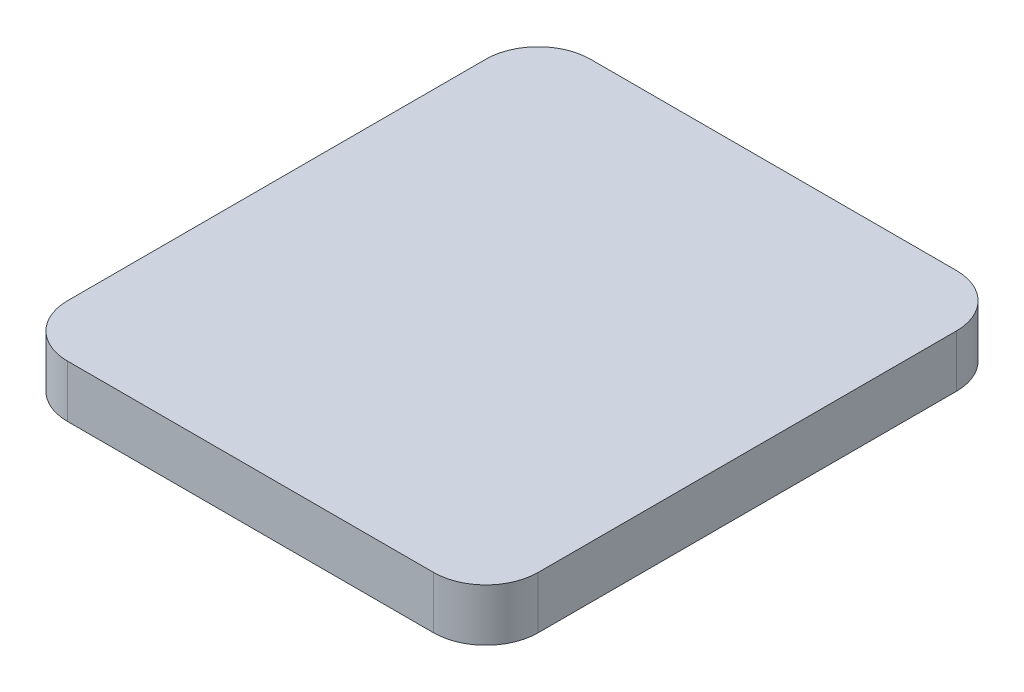
ISO-10303-21;
HEADER;
FILE_DESCRIPTION(('STEP AP214'),'2;1');
FILE_NAME('part.step','',(''),(''),'','','');
FILE_SCHEMA(('AUTOMOTIVE_DESIGN { 1 0 10303 214 1 1 1 1 }'));
ENDSEC;
DATA;
#1=APPLICATION_CONTEXT('core data for automotive mechanical design processes');
#2=APPLICATION_PROTOCOL_DEFINITION('international standard','automotive_design',2000,#1);
#3=PRODUCT_CONTEXT('',#1,'mechanical');
#4=PRODUCT('Part','Part','',(#3));
#5=PRODUCT_RELATED_PRODUCT_CATEGORY('part','',(#4));
#6=PRODUCT_DEFINITION_FORMATION('','',#4);
#7=PRODUCT_DEFINITION_CONTEXT('part definition',#1,'design');
#8=PRODUCT_DEFINITION('design','',#6,#7);
#9=PRODUCT_DEFINITION_SHAPE('','',#8);
#10=(LENGTH_UNIT() NAMED_UNIT(*) SI_UNIT(.MILLI.,.METRE.));
#11=(NAMED_UNIT(*) PLANE_ANGLE_UNIT() SI_UNIT($,.RADIAN.));
#12=(NAMED_UNIT(*) SI_UNIT($,.STERADIAN.) SOLID_ANGLE_UNIT());
#13=UNCERTAINTY_MEASURE_WITH_UNIT(LENGTH_MEASURE(1.E-05),#10,'distance_accuracy_value','');
#14=(GEOMETRIC_REPRESENTATION_CONTEXT(3) GLOBAL_UNCERTAINTY_ASSIGNED_CONTEXT((#13)) GLOBAL_UNIT_ASSIGNED_CONTEXT((#10,
#11,#12)) REPRESENTATION_CONTEXT('',''));
#15=CARTESIAN_POINT('',(0.,0.,0.));
#16=DIRECTION('',(0.,0.,1.));
#17=DIRECTION('',(1.,0.,0.));
#18=AXIS2_PLACEMENT_3D('',#15,#16,#17);
#19=CARTESIAN_POINT('',(0.,10.,0.));
#20=DIRECTION('',(-1.,0.,0.));
#21=DIRECTION('',(0.,0.,1.));
#22=AXIS2_PLACEMENT_3D('',#19,#20,#21);
#23=PLANE('',#22);
#24=DIRECTION('',(0.,0.,-1.));
#25=VECTOR('',#24,1.);
#26=CARTESIAN_POINT('',(0.,0.,0.));
#27=LINE('',#26,#25);
#28=CARTESIAN_POINT('',(0.,0.,90.));
#29=VERTEX_POINT('',#28);
#30=CARTESIAN_POINT('',(0.,0.,10.));
#31=VERTEX_POINT('',#30);
#32=EDGE_CURVE('E132',#29,#31,#27,.T.);
#33=ORIENTED_EDGE('',*,*,#32,.T.);
#34=DIRECTION('',(0.,-1.,0.));
#35=VECTOR('',#34,1.);
#36=CARTESIAN_POINT('',(0.,10.,10.));
#37=LINE('',#36,#35);
#38=CARTESIAN_POINT('',(0.,10.,10.));
#39=VERTEX_POINT('',#38);
#40=EDGE_CURVE('E155',#31,#39,#37,.F.);
#41=ORIENTED_EDGE('',*,*,#40,.T.);
#42=DIRECTION('',(0.,0.,-1.));
#43=VECTOR('',#42,1.);
#44=CARTESIAN_POINT('',(0.,10.,0.));
#45=LINE('',#44,#43);
#46=CARTESIAN_POINT('',(0.,10.,90.));
#47=VERTEX_POINT('',#46);
#48=EDGE_CURVE('E130',#47,#39,#45,.T.);
#49=ORIENTED_EDGE('',*,*,#48,.F.);
#50=DIRECTION('',(0.,-1.,0.));
#51=VECTOR('',#50,1.);
#52=CARTESIAN_POINT('',(0.,10.,90.));
#53=LINE('',#52,#51);
#54=EDGE_CURVE('E152',#47,#29,#53,.T.);
#55=ORIENTED_EDGE('',*,*,#54,.T.);
#56=EDGE_LOOP('',(#33,#41,#49,#55));
#57=FACE_BOUND('',#56,.T.);
#58=ADVANCED_FACE('F37',(#57),#23,.F.);
#59=CARTESIAN_POINT('',(0.,10.,0.));
#60=DIRECTION('',(0.,0.,1.));
#61=DIRECTION('',(1.,0.,0.));
#62=AXIS2_PLACEMENT_3D('',#59,#60,#61);
#63=PLANE('',#62);
#64=DIRECTION('',(-1.,0.,0.));
#65=VECTOR('',#64,1.);
#66=CARTESIAN_POINT('',(0.,0.,0.));
#67=LINE('',#66,#65);
#68=CARTESIAN_POINT('',(-10.,0.,0.));
#69=VERTEX_POINT('',#68);
#70=CARTESIAN_POINT('',(-80.,0.,0.));
#71=VERTEX_POINT('',#70);
#72=EDGE_CURVE('E128',#69,#71,#67,.T.);
#73=ORIENTED_EDGE('',*,*,#72,.T.);
#74=DIRECTION('',(0.,-1.,0.));
#75=VECTOR('',#74,1.);
#76=CARTESIAN_POINT('',(-80.,10.,0.));
#77=LINE('',#76,#75);
#78=CARTESIAN_POINT('',(-80.,10.,0.));
#79=VERTEX_POINT('',#78);
#80=EDGE_CURVE('E107',#71,#79,#77,.F.);
#81=ORIENTED_EDGE('',*,*,#80,.T.);
#82=DIRECTION('',(-1.,0.,0.));
#83=VECTOR('',#82,1.);
#84=CARTESIAN_POINT('',(0.,10.,0.));
#85=LINE('',#84,#83);
#86=CARTESIAN_POINT('',(-10.,10.,0.));
#87=VERTEX_POINT('',#86);
#88=EDGE_CURVE('E171',#87,#79,#85,.T.);
#89=ORIENTED_EDGE('',*,*,#88,.F.);
#90=DIRECTION('',(0.,-1.,0.));
#91=VECTOR('',#90,1.);
#92=CARTESIAN_POINT('',(-10.,10.,0.));
#93=LINE('',#92,#91);
#94=EDGE_CURVE('E112',#87,#69,#93,.T.);
#95=ORIENTED_EDGE('',*,*,#94,.T.);
#96=EDGE_LOOP('',(#73,#81,#89,#95));
#97=FACE_BOUND('',#96,.T.);
#98=ADVANCED_FACE('F188',(#97),#63,.F.);
#99=CARTESIAN_POINT('',(-90.,10.,0.));
#100=DIRECTION('',(1.,0.,0.));
#101=DIRECTION('',(0.,0.,-1.));
#102=AXIS2_PLACEMENT_3D('',#99,#100,#101);
#103=PLANE('',#102);
#104=DIRECTION('',(0.,0.,1.));
#105=VECTOR('',#104,1.);
#106=CARTESIAN_POINT('',(-90.,10.,0.));
#107=LINE('',#106,#105);
#108=CARTESIAN_POINT('',(-90.,10.,10.));
#109=VERTEX_POINT('',#108);
#110=CARTESIAN_POINT('',(-90.,10.,90.));
#111=VERTEX_POINT('',#110);
#112=EDGE_CURVE('E121',#109,#111,#107,.T.);
#113=ORIENTED_EDGE('',*,*,#112,.F.);
#114=DIRECTION('',(0.,-1.,0.));
#115=VECTOR('',#114,1.);
#116=CARTESIAN_POINT('',(-90.,10.,10.));
#117=LINE('',#116,#115);
#118=CARTESIAN_POINT('',(-90.,0.,10.));
#119=VERTEX_POINT('',#118);
#120=EDGE_CURVE('E106',#109,#119,#117,.T.);
#121=ORIENTED_EDGE('',*,*,#120,.T.);
#122=DIRECTION('',(0.,0.,1.));
#123=VECTOR('',#122,1.);
#124=CARTESIAN_POINT('',(-90.,0.,0.));
#125=LINE('',#124,#123);
#126=CARTESIAN_POINT('',(-90.,0.,90.));
#127=VERTEX_POINT('',#126);
#128=EDGE_CURVE('E119',#119,#127,#125,.T.);
#129=ORIENTED_EDGE('',*,*,#128,.T.);
#130=DIRECTION('',(0.,-1.,0.));
#131=VECTOR('',#130,1.);
#132=CARTESIAN_POINT('',(-90.,10.,90.));
#133=LINE('',#132,#131);
#134=EDGE_CURVE('E123',#127,#111,#133,.F.);
#135=ORIENTED_EDGE('',*,*,#134,.T.);
#136=EDGE_LOOP('',(#113,#121,#129,#135));
#137=FACE_BOUND('',#136,.T.);
#138=ADVANCED_FACE('F118',(#137),#103,.F.);
#139=CARTESIAN_POINT('',(0.,10.,100.));
#140=DIRECTION('',(0.,0.,-1.));
#141=DIRECTION('',(-1.,0.,0.));
#142=AXIS2_PLACEMENT_3D('',#139,#140,#141);
#143=PLANE('',#142);
#144=DIRECTION('',(1.,0.,0.));
#145=VECTOR('',#144,1.);
#146=CARTESIAN_POINT('',(0.,0.,100.));
#147=LINE('',#146,#145);
#148=CARTESIAN_POINT('',(-80.,0.,100.));
#149=VERTEX_POINT('',#148);
#150=CARTESIAN_POINT('',(-9.99999999999998,0.,100.));
#151=VERTEX_POINT('',#150);
#152=EDGE_CURVE('E127',#149,#151,#147,.T.);
#153=ORIENTED_EDGE('',*,*,#152,.T.);
#154=DIRECTION('',(0.,-1.,0.));
#155=VECTOR('',#154,1.);
#156=CARTESIAN_POINT('',(-9.99999999999999,10.,100.));
#157=LINE('',#156,#155);
#158=CARTESIAN_POINT('',(-9.99999999999998,10.,100.));
#159=VERTEX_POINT('',#158);
#160=EDGE_CURVE('E11',#151,#159,#157,.F.);
#161=ORIENTED_EDGE('',*,*,#160,.T.);
#162=DIRECTION('',(1.,0.,0.));
#163=VECTOR('',#162,1.);
#164=CARTESIAN_POINT('',(0.,10.,100.));
#165=LINE('',#164,#163);
#166=CARTESIAN_POINT('',(-80.,10.,100.));
#167=VERTEX_POINT('',#166);
#168=EDGE_CURVE('E136',#167,#159,#165,.T.);
#169=ORIENTED_EDGE('',*,*,#168,.F.);
#170=DIRECTION('',(0.,-1.,0.));
#171=VECTOR('',#170,1.);
#172=CARTESIAN_POINT('',(-80.,10.,100.));
#173=LINE('',#172,#171);
#174=EDGE_CURVE('E45',#167,#149,#173,.T.);
#175=ORIENTED_EDGE('',*,*,#174,.T.);
#176=EDGE_LOOP('',(#153,#161,#169,#175));
#177=FACE_BOUND('',#176,.T.);
#178=ADVANCED_FACE('F158',(#177),#143,.F.);
#179=CARTESIAN_POINT('',(0.,10.,0.));
#180=DIRECTION('',(0.,-1.,0.));
#181=DIRECTION('',(0.,0.,-1.));
#182=AXIS2_PLACEMENT_3D('',#179,#180,#181);
#183=PLANE('',#182);
#184=ORIENTED_EDGE('',*,*,#88,.T.);
#185=CARTESIAN_POINT('',(-80.,10.,10.));
#186=DIRECTION('',(0.,-1.,0.));
#187=DIRECTION('',(0.,0.,-1.));
#188=AXIS2_PLACEMENT_3D('',#185,#186,#187);
#189=CIRCLE('',#188,10.);
#190=EDGE_CURVE('E150',#79,#109,#189,.F.);
#191=ORIENTED_EDGE('',*,*,#190,.T.);
#192=ORIENTED_EDGE('',*,*,#112,.T.);
#193=CARTESIAN_POINT('',(-80.,10.,90.));
#194=DIRECTION('',(0.,-1.,0.));
#195=DIRECTION('',(0.,0.,-1.));
#196=AXIS2_PLACEMENT_3D('',#193,#194,#195);
#197=CIRCLE('',#196,10.);
#198=EDGE_CURVE('E57',#111,#167,#197,.F.);
#199=ORIENTED_EDGE('',*,*,#198,.T.);
#200=ORIENTED_EDGE('',*,*,#168,.T.);
#201=CARTESIAN_POINT('',(-9.99999999999999,10.,90.));
#202=DIRECTION('',(0.,-1.,0.));
#203=DIRECTION('',(0.,0.,-1.));
#204=AXIS2_PLACEMENT_3D('',#201,#202,#203);
#205=CIRCLE('',#204,10.);
#206=EDGE_CURVE('E146',#159,#47,#205,.F.);
#207=ORIENTED_EDGE('',*,*,#206,.T.);
#208=ORIENTED_EDGE('',*,*,#48,.T.);
#209=CARTESIAN_POINT('',(-10.,10.,10.));
#210=DIRECTION('',(0.,-1.,0.));
#211=DIRECTION('',(0.,0.,-1.));
#212=AXIS2_PLACEMENT_3D('',#209,#210,#211);
#213=CIRCLE('',#212,10.);
#214=EDGE_CURVE('E148',#39,#87,#213,.F.);
#215=ORIENTED_EDGE('',*,*,#214,.T.);
#216=EDGE_LOOP('',(#184,#191,#192,#199,#200,#207,#208,#215));
#217=FACE_BOUND('',#216,.T.);
#218=ADVANCED_FACE('F177',(#217),#183,.F.);
#219=CARTESIAN_POINT('',(0.,0.,0.));
#220=DIRECTION('',(0.,-1.,0.));
#221=DIRECTION('',(0.,0.,-1.));
#222=AXIS2_PLACEMENT_3D('',#219,#220,#221);
#223=PLANE('',#222);
#224=ORIENTED_EDGE('',*,*,#128,.F.);
#225=CARTESIAN_POINT('',(-80.,0.,10.));
#226=DIRECTION('',(0.,-1.,0.));
#227=DIRECTION('',(0.,0.,-1.));
#228=AXIS2_PLACEMENT_3D('',#225,#226,#227);
#229=CIRCLE('',#228,10.);
#230=EDGE_CURVE('E102',#119,#71,#229,.T.);
#231=ORIENTED_EDGE('',*,*,#230,.T.);
#232=ORIENTED_EDGE('',*,*,#72,.F.);
#233=CARTESIAN_POINT('',(-10.,0.,10.));
#234=DIRECTION('',(0.,-1.,0.));
#235=DIRECTION('',(0.,0.,-1.));
#236=AXIS2_PLACEMENT_3D('',#233,#234,#235);
#237=CIRCLE('',#236,10.);
#238=EDGE_CURVE('E113',#69,#31,#237,.T.);
#239=ORIENTED_EDGE('',*,*,#238,.T.);
#240=ORIENTED_EDGE('',*,*,#32,.F.);
#241=CARTESIAN_POINT('',(-9.99999999999999,0.,90.));
#242=DIRECTION('',(0.,-1.,0.));
#243=DIRECTION('',(0.,0.,-1.));
#244=AXIS2_PLACEMENT_3D('',#241,#242,#243);
#245=CIRCLE('',#244,10.);
#246=EDGE_CURVE('E139',#29,#151,#245,.T.);
#247=ORIENTED_EDGE('',*,*,#246,.T.);
#248=ORIENTED_EDGE('',*,*,#152,.F.);
#249=CARTESIAN_POINT('',(-80.,0.,90.));
#250=DIRECTION('',(0.,-1.,0.));
#251=DIRECTION('',(0.,0.,-1.));
#252=AXIS2_PLACEMENT_3D('',#249,#250,#251);
#253=CIRCLE('',#252,10.);
#254=EDGE_CURVE('E122',#149,#127,#253,.T.);
#255=ORIENTED_EDGE('',*,*,#254,.T.);
#256=EDGE_LOOP('',(#224,#231,#232,#239,#240,#247,#248,#255));
#257=FACE_BOUND('',#256,.T.);
#258=ADVANCED_FACE('F125',(#257),#223,.T.);
#259=CARTESIAN_POINT('',(-80.,10.,10.));
#260=DIRECTION('',(0.,-1.,0.));
#261=DIRECTION('',(0.,0.,-1.));
#262=AXIS2_PLACEMENT_3D('',#259,#260,#261);
#263=CYLINDRICAL_SURFACE('',#262,10.);
#264=ORIENTED_EDGE('',*,*,#190,.F.);
#265=ORIENTED_EDGE('',*,*,#80,.F.);
#266=ORIENTED_EDGE('',*,*,#230,.F.);
#267=ORIENTED_EDGE('',*,*,#120,.F.);
#268=EDGE_LOOP('',(#264,#265,#266,#267));
#269=FACE_BOUND('',#268,.T.);
#270=ADVANCED_FACE('F105',(#269),#263,.T.);
#271=CARTESIAN_POINT('',(-10.,10.,10.));
#272=DIRECTION('',(0.,-1.,0.));
#273=DIRECTION('',(0.,0.,-1.));
#274=AXIS2_PLACEMENT_3D('',#271,#272,#273);
#275=CYLINDRICAL_SURFACE('',#274,10.);
#276=ORIENTED_EDGE('',*,*,#214,.F.);
#277=ORIENTED_EDGE('',*,*,#40,.F.);
#278=ORIENTED_EDGE('',*,*,#238,.F.);
#279=ORIENTED_EDGE('',*,*,#94,.F.);
#280=EDGE_LOOP('',(#276,#277,#278,#279));
#281=FACE_BOUND('',#280,.T.);
#282=ADVANCED_FACE('F199',(#281),#275,.T.);
#283=CARTESIAN_POINT('',(-9.99999999999999,10.,90.));
#284=DIRECTION('',(0.,-1.,0.));
#285=DIRECTION('',(0.,0.,-1.));
#286=AXIS2_PLACEMENT_3D('',#283,#284,#285);
#287=CYLINDRICAL_SURFACE('',#286,10.);
#288=ORIENTED_EDGE('',*,*,#206,.F.);
#289=ORIENTED_EDGE('',*,*,#160,.F.);
#290=ORIENTED_EDGE('',*,*,#246,.F.);
#291=ORIENTED_EDGE('',*,*,#54,.F.);
#292=EDGE_LOOP('',(#288,#289,#290,#291));
#293=FACE_BOUND('',#292,.T.);
#294=ADVANCED_FACE('F165',(#293),#287,.T.);
#295=CARTESIAN_POINT('',(-80.,10.,90.));
#296=DIRECTION('',(0.,-1.,0.));
#297=DIRECTION('',(0.,0.,-1.));
#298=AXIS2_PLACEMENT_3D('',#295,#296,#297);
#299=CYLINDRICAL_SURFACE('',#298,10.);
#300=ORIENTED_EDGE('',*,*,#198,.F.);
#301=ORIENTED_EDGE('',*,*,#134,.F.);
#302=ORIENTED_EDGE('',*,*,#254,.F.);
#303=ORIENTED_EDGE('',*,*,#174,.F.);
#304=EDGE_LOOP('',(#300,#301,#302,#303));
#305=FACE_BOUND('',#304,.T.);
#306=ADVANCED_FACE('F39',(#305),#299,.T.);
#307=CLOSED_SHELL('',(#58,#98,#138,#178,#218,#258,#270,#282,#294,#306));
#308=MANIFOLD_SOLID_BREP('B2',#307);
#309=ADVANCED_BREP_SHAPE_REPRESENTATION('',(#18,#308),#14);
#310=SHAPE_DEFINITION_REPRESENTATION(#9,#309);
ENDSEC;
END-ISO-10303-21;
